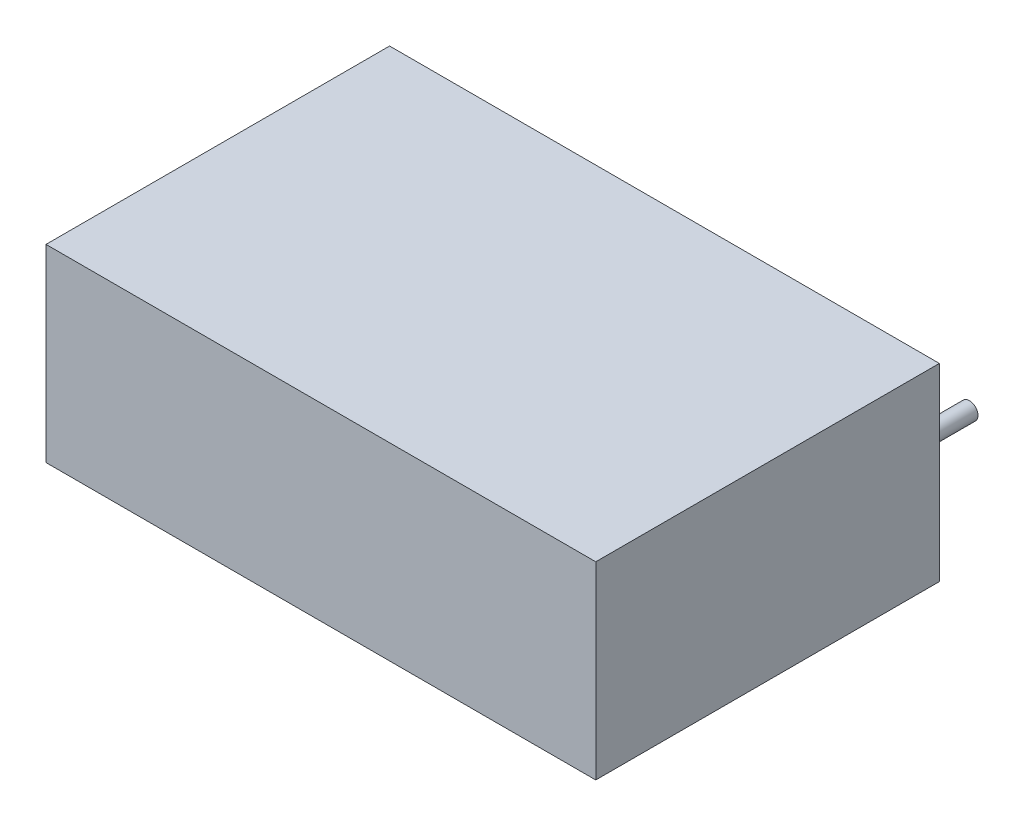
ISO-10303-21;
HEADER;
FILE_DESCRIPTION(('STEP AP214'),'2;1');
FILE_NAME('part.step','',(''),(''),'','','');
FILE_SCHEMA(('AUTOMOTIVE_DESIGN { 1 0 10303 214 1 1 1 1 }'));
ENDSEC;
DATA;
#1=APPLICATION_CONTEXT('core data for automotive mechanical design processes');
#2=APPLICATION_PROTOCOL_DEFINITION('international standard','automotive_design',2000,#1);
#3=PRODUCT_CONTEXT('',#1,'mechanical');
#4=PRODUCT('Part','Part','',(#3));
#5=PRODUCT_RELATED_PRODUCT_CATEGORY('part','',(#4));
#6=PRODUCT_DEFINITION_FORMATION('','',#4);
#7=PRODUCT_DEFINITION_CONTEXT('part definition',#1,'design');
#8=PRODUCT_DEFINITION('design','',#6,#7);
#9=PRODUCT_DEFINITION_SHAPE('','',#8);
#10=(LENGTH_UNIT() NAMED_UNIT(*) SI_UNIT(.MILLI.,.METRE.));
#11=(NAMED_UNIT(*) PLANE_ANGLE_UNIT() SI_UNIT($,.RADIAN.));
#12=(NAMED_UNIT(*) SI_UNIT($,.STERADIAN.) SOLID_ANGLE_UNIT());
#13=UNCERTAINTY_MEASURE_WITH_UNIT(LENGTH_MEASURE(1.E-05),#10,'distance_accuracy_value','');
#14=(GEOMETRIC_REPRESENTATION_CONTEXT(3) GLOBAL_UNCERTAINTY_ASSIGNED_CONTEXT((#13)) GLOBAL_UNIT_ASSIGNED_CONTEXT((#10,
#11,#12)) REPRESENTATION_CONTEXT('',''));
#15=CARTESIAN_POINT('',(0.,0.,0.));
#16=DIRECTION('',(0.,0.,1.));
#17=DIRECTION('',(1.,0.,0.));
#18=AXIS2_PLACEMENT_3D('',#15,#16,#17);
#19=CARTESIAN_POINT('',(-0.5,5.5,0.));
#20=DIRECTION('',(0.,0.,1.));
#21=DIRECTION('',(1.,0.,0.));
#22=AXIS2_PLACEMENT_3D('',#19,#20,#21);
#23=PLANE('',#22);
#24=CARTESIAN_POINT('',(1.75,0.,0.));
#25=DIRECTION('',(0.,0.,1.));
#26=DIRECTION('',(1.,0.,0.));
#27=AXIS2_PLACEMENT_3D('',#24,#25,#26);
#28=CIRCLE('',#27,0.499999999999999);
#29=CARTESIAN_POINT('',(2.25,0.,0.));
#30=VERTEX_POINT('',#29);
#31=EDGE_CURVE('E40',#30,#30,#28,.F.);
#32=ORIENTED_EDGE('',*,*,#31,.F.);
#33=EDGE_LOOP('',(#32));
#34=FACE_BOUND('',#33,.T.);
#35=DIRECTION('',(-1.,0.,0.));
#36=VECTOR('',#35,1.);
#37=CARTESIAN_POINT('',(31.5,5.5,0.));
#38=LINE('',#37,#36);
#39=CARTESIAN_POINT('',(31.5,5.5,0.));
#40=VERTEX_POINT('',#39);
#41=CARTESIAN_POINT('',(-0.5,5.5,0.));
#42=VERTEX_POINT('',#41);
#43=EDGE_CURVE('E99',#40,#42,#38,.T.);
#44=ORIENTED_EDGE('',*,*,#43,.F.);
#45=DIRECTION('',(0.,1.,0.));
#46=VECTOR('',#45,1.);
#47=CARTESIAN_POINT('',(31.5,-5.5,0.));
#48=LINE('',#47,#46);
#49=CARTESIAN_POINT('',(31.5,-5.5,0.));
#50=VERTEX_POINT('',#49);
#51=EDGE_CURVE('E71',#50,#40,#48,.T.);
#52=ORIENTED_EDGE('',*,*,#51,.F.);
#53=DIRECTION('',(1.,0.,0.));
#54=VECTOR('',#53,1.);
#55=CARTESIAN_POINT('',(-0.499999999999999,-5.5,0.));
#56=LINE('',#55,#54);
#57=CARTESIAN_POINT('',(-0.499999999999999,-5.5,0.));
#58=VERTEX_POINT('',#57);
#59=EDGE_CURVE('E65',#58,#50,#56,.T.);
#60=ORIENTED_EDGE('',*,*,#59,.F.);
#61=DIRECTION('',(0.,-1.,0.));
#62=VECTOR('',#61,1.);
#63=CARTESIAN_POINT('',(-0.5,5.5,0.));
#64=LINE('',#63,#62);
#65=EDGE_CURVE('E89',#42,#58,#64,.T.);
#66=ORIENTED_EDGE('',*,*,#65,.F.);
#67=EDGE_LOOP('',(#44,#52,#60,#66));
#68=FACE_BOUND('',#67,.T.);
#69=CARTESIAN_POINT('',(29.25,0.,0.));
#70=DIRECTION('',(0.,0.,1.));
#71=DIRECTION('',(1.,0.,0.));
#72=AXIS2_PLACEMENT_3D('',#69,#70,#71);
#73=CIRCLE('',#72,0.499999999999999);
#74=CARTESIAN_POINT('',(29.75,0.,0.));
#75=VERTEX_POINT('',#74);
#76=EDGE_CURVE('E11',#75,#75,#73,.F.);
#77=ORIENTED_EDGE('',*,*,#76,.F.);
#78=EDGE_LOOP('',(#77));
#79=FACE_BOUND('',#78,.T.);
#80=ADVANCED_FACE('F31',(#34,#68,#79),#23,.F.);
#81=CARTESIAN_POINT('',(31.5,5.5,20.));
#82=DIRECTION('',(0.,-1.,0.));
#83=DIRECTION('',(1.,0.,0.));
#84=AXIS2_PLACEMENT_3D('',#81,#82,#83);
#85=PLANE('',#84);
#86=ORIENTED_EDGE('',*,*,#43,.T.);
#87=DIRECTION('',(0.,0.,-1.));
#88=VECTOR('',#87,1.);
#89=CARTESIAN_POINT('',(-0.5,5.5,20.));
#90=LINE('',#89,#88);
#91=CARTESIAN_POINT('',(-0.5,5.5,20.));
#92=VERTEX_POINT('',#91);
#93=EDGE_CURVE('E90',#92,#42,#90,.T.);
#94=ORIENTED_EDGE('',*,*,#93,.F.);
#95=DIRECTION('',(-1.,0.,0.));
#96=VECTOR('',#95,1.);
#97=CARTESIAN_POINT('',(31.5,5.5,20.));
#98=LINE('',#97,#96);
#99=CARTESIAN_POINT('',(31.5,5.5,20.));
#100=VERTEX_POINT('',#99);
#101=EDGE_CURVE('E84',#100,#92,#98,.T.);
#102=ORIENTED_EDGE('',*,*,#101,.F.);
#103=DIRECTION('',(0.,0.,-1.));
#104=VECTOR('',#103,1.);
#105=CARTESIAN_POINT('',(31.5,5.5,20.));
#106=LINE('',#105,#104);
#107=EDGE_CURVE('E95',#100,#40,#106,.T.);
#108=ORIENTED_EDGE('',*,*,#107,.T.);
#109=EDGE_LOOP('',(#86,#94,#102,#108));
#110=FACE_BOUND('',#109,.T.);
#111=ADVANCED_FACE('F33',(#110),#85,.F.);
#112=CARTESIAN_POINT('',(-0.5,5.5,20.));
#113=DIRECTION('',(1.,0.,0.));
#114=DIRECTION('',(0.,1.,0.));
#115=AXIS2_PLACEMENT_3D('',#112,#113,#114);
#116=PLANE('',#115);
#117=ORIENTED_EDGE('',*,*,#65,.T.);
#118=DIRECTION('',(0.,0.,-1.));
#119=VECTOR('',#118,1.);
#120=CARTESIAN_POINT('',(-0.499999999999999,-5.5,20.));
#121=LINE('',#120,#119);
#122=CARTESIAN_POINT('',(-0.499999999999999,-5.5,20.));
#123=VERTEX_POINT('',#122);
#124=EDGE_CURVE('E87',#123,#58,#121,.T.);
#125=ORIENTED_EDGE('',*,*,#124,.F.);
#126=DIRECTION('',(0.,-1.,0.));
#127=VECTOR('',#126,1.);
#128=CARTESIAN_POINT('',(-0.5,5.5,20.));
#129=LINE('',#128,#127);
#130=EDGE_CURVE('E79',#92,#123,#129,.T.);
#131=ORIENTED_EDGE('',*,*,#130,.F.);
#132=ORIENTED_EDGE('',*,*,#93,.T.);
#133=EDGE_LOOP('',(#117,#125,#131,#132));
#134=FACE_BOUND('',#133,.T.);
#135=ADVANCED_FACE('F88',(#134),#116,.F.);
#136=CARTESIAN_POINT('',(-0.499999999999999,-5.5,20.));
#137=DIRECTION('',(0.,1.,0.));
#138=DIRECTION('',(0.,0.,1.));
#139=AXIS2_PLACEMENT_3D('',#136,#137,#138);
#140=PLANE('',#139);
#141=ORIENTED_EDGE('',*,*,#59,.T.);
#142=DIRECTION('',(0.,0.,-1.));
#143=VECTOR('',#142,1.);
#144=CARTESIAN_POINT('',(31.5,-5.5,20.));
#145=LINE('',#144,#143);
#146=CARTESIAN_POINT('',(31.5,-5.5,20.));
#147=VERTEX_POINT('',#146);
#148=EDGE_CURVE('E91',#147,#50,#145,.T.);
#149=ORIENTED_EDGE('',*,*,#148,.F.);
#150=DIRECTION('',(1.,0.,0.));
#151=VECTOR('',#150,1.);
#152=CARTESIAN_POINT('',(-0.499999999999999,-5.5,20.));
#153=LINE('',#152,#151);
#154=EDGE_CURVE('E82',#123,#147,#153,.T.);
#155=ORIENTED_EDGE('',*,*,#154,.F.);
#156=ORIENTED_EDGE('',*,*,#124,.T.);
#157=EDGE_LOOP('',(#141,#149,#155,#156));
#158=FACE_BOUND('',#157,.T.);
#159=ADVANCED_FACE('F93',(#158),#140,.F.);
#160=CARTESIAN_POINT('',(31.5,-5.5,20.));
#161=DIRECTION('',(-1.,0.,0.));
#162=DIRECTION('',(0.,0.,1.));
#163=AXIS2_PLACEMENT_3D('',#160,#161,#162);
#164=PLANE('',#163);
#165=ORIENTED_EDGE('',*,*,#51,.T.);
#166=ORIENTED_EDGE('',*,*,#107,.F.);
#167=DIRECTION('',(0.,1.,0.));
#168=VECTOR('',#167,1.);
#169=CARTESIAN_POINT('',(31.5,-5.5,20.));
#170=LINE('',#169,#168);
#171=EDGE_CURVE('E48',#147,#100,#170,.T.);
#172=ORIENTED_EDGE('',*,*,#171,.F.);
#173=ORIENTED_EDGE('',*,*,#148,.T.);
#174=EDGE_LOOP('',(#165,#166,#172,#173));
#175=FACE_BOUND('',#174,.T.);
#176=ADVANCED_FACE('F140',(#175),#164,.F.);
#177=CARTESIAN_POINT('',(-0.5,5.5,20.));
#178=DIRECTION('',(0.,0.,1.));
#179=DIRECTION('',(1.,0.,0.));
#180=AXIS2_PLACEMENT_3D('',#177,#178,#179);
#181=PLANE('',#180);
#182=ORIENTED_EDGE('',*,*,#101,.T.);
#183=ORIENTED_EDGE('',*,*,#130,.T.);
#184=ORIENTED_EDGE('',*,*,#154,.T.);
#185=ORIENTED_EDGE('',*,*,#171,.T.);
#186=EDGE_LOOP('',(#182,#183,#184,#185));
#187=FACE_BOUND('',#186,.T.);
#188=ADVANCED_FACE('F80',(#187),#181,.T.);
#189=CARTESIAN_POINT('',(1.75,0.,-4.));
#190=DIRECTION('',(0.,0.,1.));
#191=DIRECTION('',(1.,0.,0.));
#192=AXIS2_PLACEMENT_3D('',#189,#190,#191);
#193=CYLINDRICAL_SURFACE('',#192,0.499999999999999);
#194=CARTESIAN_POINT('',(1.75,0.,-4.));
#195=DIRECTION('',(0.,0.,-1.));
#196=DIRECTION('',(-1.,0.,0.));
#197=AXIS2_PLACEMENT_3D('',#194,#195,#196);
#198=CIRCLE('',#197,0.499999999999999);
#199=CARTESIAN_POINT('',(1.25,0.,-4.));
#200=VERTEX_POINT('',#199);
#201=EDGE_CURVE('E102',#200,#200,#198,.T.);
#202=ORIENTED_EDGE('',*,*,#201,.F.);
#203=EDGE_LOOP('',(#202));
#204=FACE_BOUND('',#203,.T.);
#205=ORIENTED_EDGE('',*,*,#31,.T.);
#206=EDGE_LOOP('',(#205));
#207=FACE_BOUND('',#206,.T.);
#208=ADVANCED_FACE('F111',(#204,#207),#193,.T.);
#209=CARTESIAN_POINT('',(1.75,0.,-4.));
#210=DIRECTION('',(0.,0.,-1.));
#211=DIRECTION('',(-1.,0.,0.));
#212=AXIS2_PLACEMENT_3D('',#209,#210,#211);
#213=PLANE('',#212);
#214=ORIENTED_EDGE('',*,*,#201,.T.);
#215=EDGE_LOOP('',(#214));
#216=FACE_BOUND('',#215,.T.);
#217=ADVANCED_FACE('F123',(#216),#213,.T.);
#218=CARTESIAN_POINT('',(29.25,0.,-4.));
#219=DIRECTION('',(0.,0.,1.));
#220=DIRECTION('',(1.,0.,0.));
#221=AXIS2_PLACEMENT_3D('',#218,#219,#220);
#222=CYLINDRICAL_SURFACE('',#221,0.499999999999999);
#223=CARTESIAN_POINT('',(29.25,0.,-4.));
#224=DIRECTION('',(0.,0.,-1.));
#225=DIRECTION('',(1.,0.,0.));
#226=AXIS2_PLACEMENT_3D('',#223,#224,#225);
#227=CIRCLE('',#226,0.499999999999999);
#228=CARTESIAN_POINT('',(29.75,0.,-4.));
#229=VERTEX_POINT('',#228);
#230=EDGE_CURVE('E155',#229,#229,#227,.T.);
#231=ORIENTED_EDGE('',*,*,#230,.F.);
#232=EDGE_LOOP('',(#231));
#233=FACE_BOUND('',#232,.T.);
#234=ORIENTED_EDGE('',*,*,#76,.T.);
#235=EDGE_LOOP('',(#234));
#236=FACE_BOUND('',#235,.T.);
#237=ADVANCED_FACE('F120',(#233,#236),#222,.T.);
#238=CARTESIAN_POINT('',(29.25,0.,-4.));
#239=DIRECTION('',(0.,0.,1.));
#240=DIRECTION('',(1.,0.,0.));
#241=AXIS2_PLACEMENT_3D('',#238,#239,#240);
#242=PLANE('',#241);
#243=ORIENTED_EDGE('',*,*,#230,.T.);
#244=EDGE_LOOP('',(#243));
#245=FACE_BOUND('',#244,.T.);
#246=ADVANCED_FACE('F122',(#245),#242,.F.);
#247=CLOSED_SHELL('',(#80,#111,#135,#159,#176,#188,#208,#217,#237,#246));
#248=MANIFOLD_SOLID_BREP('B2',#247);
#249=ADVANCED_BREP_SHAPE_REPRESENTATION('',(#18,#248),#14);
#250=SHAPE_DEFINITION_REPRESENTATION(#9,#249);
ENDSEC;
END-ISO-10303-21;
